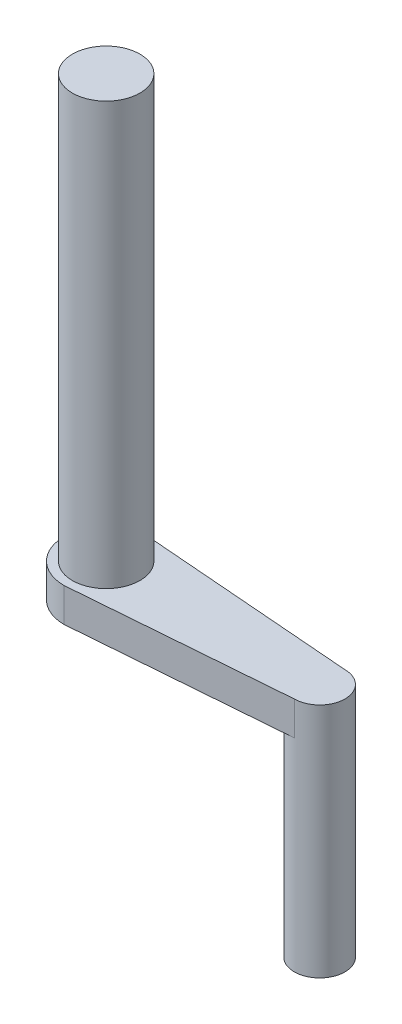
ISO-10303-21;
HEADER;
FILE_DESCRIPTION(('STEP AP214'),'2;1');
FILE_NAME('part.step','',(''),(''),'','','');
FILE_SCHEMA(('AUTOMOTIVE_DESIGN { 1 0 10303 214 1 1 1 1 }'));
ENDSEC;
DATA;
#1=APPLICATION_CONTEXT('core data for automotive mechanical design processes');
#2=APPLICATION_PROTOCOL_DEFINITION('international standard','automotive_design',2000,#1);
#3=PRODUCT_CONTEXT('',#1,'mechanical');
#4=PRODUCT('Part','Part','',(#3));
#5=PRODUCT_RELATED_PRODUCT_CATEGORY('part','',(#4));
#6=PRODUCT_DEFINITION_FORMATION('','',#4);
#7=PRODUCT_DEFINITION_CONTEXT('part definition',#1,'design');
#8=PRODUCT_DEFINITION('design','',#6,#7);
#9=PRODUCT_DEFINITION_SHAPE('','',#8);
#10=(LENGTH_UNIT() NAMED_UNIT(*) SI_UNIT(.MILLI.,.METRE.));
#11=(NAMED_UNIT(*) PLANE_ANGLE_UNIT() SI_UNIT($,.RADIAN.));
#12=(NAMED_UNIT(*) SI_UNIT($,.STERADIAN.) SOLID_ANGLE_UNIT());
#13=UNCERTAINTY_MEASURE_WITH_UNIT(LENGTH_MEASURE(1.E-05),#10,'distance_accuracy_value','');
#14=(GEOMETRIC_REPRESENTATION_CONTEXT(3) GLOBAL_UNCERTAINTY_ASSIGNED_CONTEXT((#13)) GLOBAL_UNIT_ASSIGNED_CONTEXT((#10,
#11,#12)) REPRESENTATION_CONTEXT('',''));
#15=CARTESIAN_POINT('',(0.,0.,0.));
#16=DIRECTION('',(0.,0.,1.));
#17=DIRECTION('',(1.,0.,0.));
#18=AXIS2_PLACEMENT_3D('',#15,#16,#17);
#19=CARTESIAN_POINT('',(-80.7708042666455,2.,-27.2954139520102));
#20=DIRECTION('',(0.,-1.,0.));
#21=DIRECTION('',(0.,0.,-1.));
#22=AXIS2_PLACEMENT_3D('',#19,#20,#21);
#23=CYLINDRICAL_SURFACE('',#22,2.5);
#24=CARTESIAN_POINT('',(-80.7708042666455,0.,-27.2954139520102));
#25=DIRECTION('',(0.,1.,0.));
#26=DIRECTION('',(0.,0.,1.));
#27=AXIS2_PLACEMENT_3D('',#24,#25,#26);
#28=CIRCLE('',#27,2.5);
#29=CARTESIAN_POINT('',(-80.7708042666455,0.,-29.7954139520102));
#30=VERTEX_POINT('',#29);
#31=CARTESIAN_POINT('',(-80.7708042666455,0.,-24.7954139520102));
#32=VERTEX_POINT('',#31);
#33=EDGE_CURVE('E92',#30,#32,#28,.T.);
#34=ORIENTED_EDGE('',*,*,#33,.T.);
#35=DIRECTION('',(0.,-1.,0.));
#36=VECTOR('',#35,1.);
#37=CARTESIAN_POINT('',(-80.7708042666455,2.,-24.7954139520102));
#38=LINE('',#37,#36);
#39=CARTESIAN_POINT('',(-80.7708042666455,2.,-24.7954139520102));
#40=VERTEX_POINT('',#39);
#41=EDGE_CURVE('E46',#40,#32,#38,.T.);
#42=ORIENTED_EDGE('',*,*,#41,.F.);
#43=CARTESIAN_POINT('',(-80.7708042666455,2.,-27.2954139520102));
#44=DIRECTION('',(0.,1.,0.));
#45=DIRECTION('',(0.,0.,1.));
#46=AXIS2_PLACEMENT_3D('',#43,#44,#45);
#47=CIRCLE('',#46,2.5);
#48=CARTESIAN_POINT('',(-80.7708042666455,2.,-29.7954139520102));
#49=VERTEX_POINT('',#48);
#50=EDGE_CURVE('E94',#49,#40,#47,.T.);
#51=ORIENTED_EDGE('',*,*,#50,.F.);
#52=DIRECTION('',(0.,-1.,0.));
#53=VECTOR('',#52,1.);
#54=CARTESIAN_POINT('',(-80.7708042666455,2.,-29.7954139520102));
#55=LINE('',#54,#53);
#56=EDGE_CURVE('E104',#49,#30,#55,.T.);
#57=ORIENTED_EDGE('',*,*,#56,.T.);
#58=EDGE_LOOP('',(#34,#42,#51,#57));
#59=FACE_BOUND('',#58,.T.);
#60=ADVANCED_FACE('F43',(#59),#23,.T.);
#61=CARTESIAN_POINT('',(-80.7708042666455,2.,-24.7954139520102));
#62=DIRECTION('',(-0.0788595713199776,0.,-0.996885734681377));
#63=DIRECTION('',(-0.996885734681377,0.,0.0788595713199776));
#64=AXIS2_PLACEMENT_3D('',#61,#62,#63);
#65=PLANE('',#64);
#66=DIRECTION('',(0.996885734681377,0.,-0.0788595713199776));
#67=VECTOR('',#66,1.);
#68=CARTESIAN_POINT('',(-80.7708042666455,0.,-24.7954139520102));
#69=LINE('',#68,#67);
#70=CARTESIAN_POINT('',(-68.1295266386415,0.,-25.79541395201));
#71=VERTEX_POINT('',#70);
#72=EDGE_CURVE('E95',#32,#71,#69,.T.);
#73=ORIENTED_EDGE('',*,*,#72,.T.);
#74=DIRECTION('',(0.,-1.,0.));
#75=VECTOR('',#74,1.);
#76=CARTESIAN_POINT('',(-68.1295266386415,2.,-25.79541395201));
#77=LINE('',#76,#75);
#78=CARTESIAN_POINT('',(-68.1295266386415,2.,-25.79541395201));
#79=VERTEX_POINT('',#78);
#80=EDGE_CURVE('E103',#79,#71,#77,.T.);
#81=ORIENTED_EDGE('',*,*,#80,.F.);
#82=DIRECTION('',(0.996885734681377,0.,-0.0788595713199776));
#83=VECTOR('',#82,1.);
#84=CARTESIAN_POINT('',(-80.7708042666455,2.,-24.7954139520102));
#85=LINE('',#84,#83);
#86=EDGE_CURVE('E87',#40,#79,#85,.T.);
#87=ORIENTED_EDGE('',*,*,#86,.F.);
#88=ORIENTED_EDGE('',*,*,#41,.T.);
#89=EDGE_LOOP('',(#73,#81,#87,#88));
#90=FACE_BOUND('',#89,.T.);
#91=ADVANCED_FACE('F142',(#90),#65,.F.);
#92=CARTESIAN_POINT('',(-68.1295266386415,2.,-27.2954139520102));
#93=DIRECTION('',(0.,-1.,0.));
#94=DIRECTION('',(0.,0.,-1.));
#95=AXIS2_PLACEMENT_3D('',#92,#93,#94);
#96=CYLINDRICAL_SURFACE('',#95,1.50000000000016);
#97=ORIENTED_EDGE('',*,*,#80,.T.);
#98=CARTESIAN_POINT('',(-68.1295266386415,0.,-27.2954139520102));
#99=DIRECTION('',(0.,-1.,0.));
#100=DIRECTION('',(0.,0.,-1.));
#101=AXIS2_PLACEMENT_3D('',#98,#99,#100);
#102=CIRCLE('',#101,1.50000000000017);
#103=CARTESIAN_POINT('',(-68.1295266386417,0.,-28.7954139520103));
#104=VERTEX_POINT('',#103);
#105=EDGE_CURVE('E11',#71,#104,#102,.T.);
#106=ORIENTED_EDGE('',*,*,#105,.T.);
#107=DIRECTION('',(0.,-1.,0.));
#108=VECTOR('',#107,1.);
#109=CARTESIAN_POINT('',(-68.1295266386415,2.,-28.7954139520103));
#110=LINE('',#109,#108);
#111=CARTESIAN_POINT('',(-68.1295266386415,2.,-28.7954139520103));
#112=VERTEX_POINT('',#111);
#113=EDGE_CURVE('E98',#112,#104,#110,.T.);
#114=ORIENTED_EDGE('',*,*,#113,.F.);
#115=CARTESIAN_POINT('',(-68.1295266386415,2.,-27.2954139520102));
#116=DIRECTION('',(0.,1.,0.));
#117=DIRECTION('',(0.,0.,1.));
#118=AXIS2_PLACEMENT_3D('',#115,#116,#117);
#119=CIRCLE('',#118,1.50000000000016);
#120=EDGE_CURVE('E109',#79,#112,#119,.T.);
#121=ORIENTED_EDGE('',*,*,#120,.F.);
#122=EDGE_LOOP('',(#97,#106,#114,#121));
#123=FACE_BOUND('',#122,.T.);
#124=CARTESIAN_POINT('',(-68.1295266386415,-12.,-27.2954139520102));
#125=DIRECTION('',(0.,-1.,0.));
#126=DIRECTION('',(0.,0.,-1.));
#127=AXIS2_PLACEMENT_3D('',#124,#125,#126);
#128=CIRCLE('',#127,1.50000000000017);
#129=CARTESIAN_POINT('',(-68.1295266386415,-12.,-28.7954139520103));
#130=VERTEX_POINT('',#129);
#131=EDGE_CURVE('E132',#130,#130,#128,.T.);
#132=ORIENTED_EDGE('',*,*,#131,.F.);
#133=EDGE_LOOP('',(#132));
#134=FACE_BOUND('',#133,.T.);
#135=ADVANCED_FACE('F107',(#123,#134),#96,.T.);
#136=CARTESIAN_POINT('',(-80.7708042666455,2.,-29.7954139520102));
#137=DIRECTION('',(-0.0788595713199774,0.,0.996885734681377));
#138=DIRECTION('',(0.996885734681377,0.,0.0788595713199774));
#139=AXIS2_PLACEMENT_3D('',#136,#137,#138);
#140=PLANE('',#139);
#141=DIRECTION('',(-0.996885734681377,0.,-0.0788595713199774));
#142=VECTOR('',#141,1.);
#143=CARTESIAN_POINT('',(-80.7708042666455,0.,-29.7954139520102));
#144=LINE('',#143,#142);
#145=EDGE_CURVE('E79',#104,#30,#144,.T.);
#146=ORIENTED_EDGE('',*,*,#145,.T.);
#147=ORIENTED_EDGE('',*,*,#56,.F.);
#148=DIRECTION('',(-0.996885734681377,0.,-0.0788595713199774));
#149=VECTOR('',#148,1.);
#150=CARTESIAN_POINT('',(-80.7708042666455,2.,-29.7954139520102));
#151=LINE('',#150,#149);
#152=EDGE_CURVE('E61',#112,#49,#151,.T.);
#153=ORIENTED_EDGE('',*,*,#152,.F.);
#154=ORIENTED_EDGE('',*,*,#113,.T.);
#155=EDGE_LOOP('',(#146,#147,#153,#154));
#156=FACE_BOUND('',#155,.T.);
#157=ADVANCED_FACE('F99',(#156),#140,.F.);
#158=CARTESIAN_POINT('',(-80.7708042666455,2.,-27.2954139520102));
#159=DIRECTION('',(0.,1.,0.));
#160=DIRECTION('',(0.,0.,1.));
#161=AXIS2_PLACEMENT_3D('',#158,#159,#160);
#162=PLANE('',#161);
#163=CARTESIAN_POINT('',(-80.7708042666455,2.,-27.2954139520102));
#164=DIRECTION('',(0.,1.,0.));
#165=DIRECTION('',(0.,0.,1.));
#166=AXIS2_PLACEMENT_3D('',#163,#164,#165);
#167=CIRCLE('',#166,2.);
#168=CARTESIAN_POINT('',(-80.7708042666455,2.,-25.2954139520102));
#169=VERTEX_POINT('',#168);
#170=EDGE_CURVE('E128',#169,#169,#167,.T.);
#171=ORIENTED_EDGE('',*,*,#170,.F.);
#172=EDGE_LOOP('',(#171));
#173=FACE_BOUND('',#172,.T.);
#174=ORIENTED_EDGE('',*,*,#50,.T.);
#175=ORIENTED_EDGE('',*,*,#86,.T.);
#176=ORIENTED_EDGE('',*,*,#120,.T.);
#177=ORIENTED_EDGE('',*,*,#152,.T.);
#178=EDGE_LOOP('',(#174,#175,#176,#177));
#179=FACE_BOUND('',#178,.T.);
#180=ADVANCED_FACE('F148',(#173,#179),#162,.T.);
#181=CARTESIAN_POINT('',(-80.7708042666455,0.,-27.2954139520102));
#182=DIRECTION('',(0.,1.,0.));
#183=DIRECTION('',(0.,0.,1.));
#184=AXIS2_PLACEMENT_3D('',#181,#182,#183);
#185=PLANE('',#184);
#186=ORIENTED_EDGE('',*,*,#105,.F.);
#187=ORIENTED_EDGE('',*,*,#72,.F.);
#188=ORIENTED_EDGE('',*,*,#33,.F.);
#189=ORIENTED_EDGE('',*,*,#145,.F.);
#190=EDGE_LOOP('',(#186,#187,#188,#189));
#191=FACE_BOUND('',#190,.T.);
#192=ADVANCED_FACE('F90',(#191),#185,.F.);
#193=CARTESIAN_POINT('',(-80.7708042666455,27.,-27.2954139520102));
#194=DIRECTION('',(0.,-1.,0.));
#195=DIRECTION('',(0.,0.,-1.));
#196=AXIS2_PLACEMENT_3D('',#193,#194,#195);
#197=CYLINDRICAL_SURFACE('',#196,2.);
#198=CARTESIAN_POINT('',(-80.7708042666455,27.,-27.2954139520102));
#199=DIRECTION('',(0.,1.,0.));
#200=DIRECTION('',(0.,0.,1.));
#201=AXIS2_PLACEMENT_3D('',#198,#199,#200);
#202=CIRCLE('',#201,2.);
#203=CARTESIAN_POINT('',(-80.7708042666455,27.,-25.2954139520102));
#204=VERTEX_POINT('',#203);
#205=EDGE_CURVE('E119',#204,#204,#202,.T.);
#206=ORIENTED_EDGE('',*,*,#205,.F.);
#207=EDGE_LOOP('',(#206));
#208=FACE_BOUND('',#207,.T.);
#209=ORIENTED_EDGE('',*,*,#170,.T.);
#210=EDGE_LOOP('',(#209));
#211=FACE_BOUND('',#210,.T.);
#212=ADVANCED_FACE('F162',(#208,#211),#197,.T.);
#213=CARTESIAN_POINT('',(-80.7708042666455,27.,-27.2954139520102));
#214=DIRECTION('',(0.,1.,0.));
#215=DIRECTION('',(0.,0.,1.));
#216=AXIS2_PLACEMENT_3D('',#213,#214,#215);
#217=PLANE('',#216);
#218=ORIENTED_EDGE('',*,*,#205,.T.);
#219=EDGE_LOOP('',(#218));
#220=FACE_BOUND('',#219,.T.);
#221=ADVANCED_FACE('F168',(#220),#217,.T.);
#222=CARTESIAN_POINT('',(-68.1295266386415,-12.,-27.2954139520102));
#223=DIRECTION('',(0.,-1.,0.));
#224=DIRECTION('',(0.,0.,-1.));
#225=AXIS2_PLACEMENT_3D('',#222,#223,#224);
#226=PLANE('',#225);
#227=ORIENTED_EDGE('',*,*,#131,.T.);
#228=EDGE_LOOP('',(#227));
#229=FACE_BOUND('',#228,.T.);
#230=ADVANCED_FACE('F140',(#229),#226,.T.);
#231=CLOSED_SHELL('',(#60,#91,#135,#157,#180,#192,#212,#221,#230));
#232=MANIFOLD_SOLID_BREP('B2',#231);
#233=ADVANCED_BREP_SHAPE_REPRESENTATION('',(#18,#232),#14);
#234=SHAPE_DEFINITION_REPRESENTATION(#9,#233);
ENDSEC;
END-ISO-10303-21;
